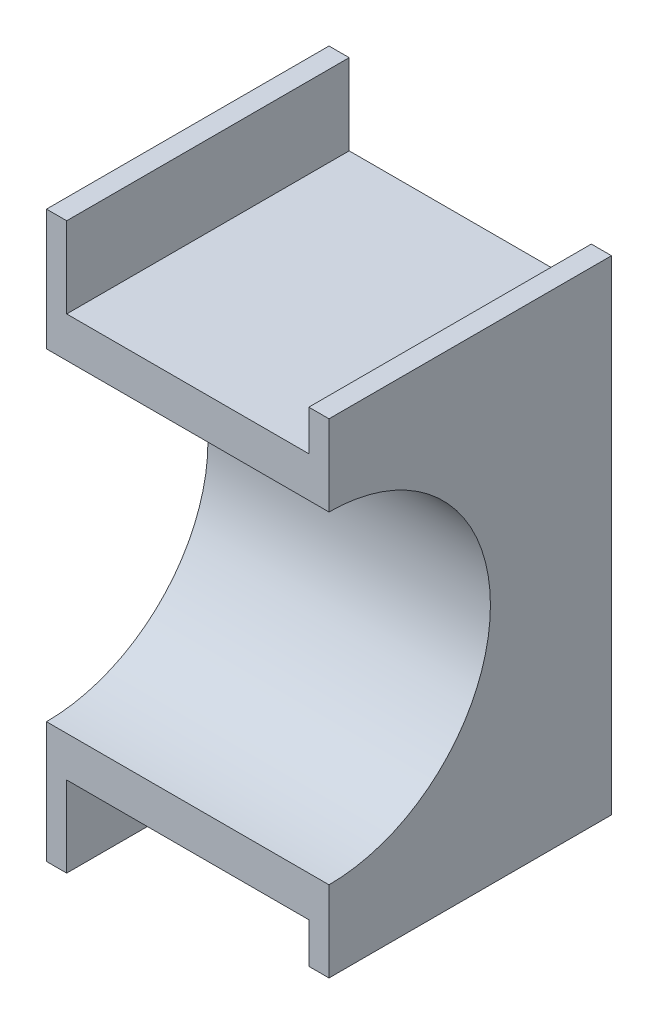
ISO-10303-21;
HEADER;
FILE_DESCRIPTION(('STEP AP214'),'2;1');
FILE_NAME('part.step','',(''),(''),'','','');
FILE_SCHEMA(('AUTOMOTIVE_DESIGN { 1 0 10303 214 1 1 1 1 }'));
ENDSEC;
DATA;
#1=APPLICATION_CONTEXT('core data for automotive mechanical design processes');
#2=APPLICATION_PROTOCOL_DEFINITION('international standard','automotive_design',2000,#1);
#3=PRODUCT_CONTEXT('',#1,'mechanical');
#4=PRODUCT('Part','Part','',(#3));
#5=PRODUCT_RELATED_PRODUCT_CATEGORY('part','',(#4));
#6=PRODUCT_DEFINITION_FORMATION('','',#4);
#7=PRODUCT_DEFINITION_CONTEXT('part definition',#1,'design');
#8=PRODUCT_DEFINITION('design','',#6,#7);
#9=PRODUCT_DEFINITION_SHAPE('','',#8);
#10=(LENGTH_UNIT() NAMED_UNIT(*) SI_UNIT(.MILLI.,.METRE.));
#11=(NAMED_UNIT(*) PLANE_ANGLE_UNIT() SI_UNIT($,.RADIAN.));
#12=(NAMED_UNIT(*) SI_UNIT($,.STERADIAN.) SOLID_ANGLE_UNIT());
#13=UNCERTAINTY_MEASURE_WITH_UNIT(LENGTH_MEASURE(1.E-05),#10,'distance_accuracy_value','');
#14=(GEOMETRIC_REPRESENTATION_CONTEXT(3) GLOBAL_UNCERTAINTY_ASSIGNED_CONTEXT((#13)) GLOBAL_UNIT_ASSIGNED_CONTEXT((#10,
#11,#12)) REPRESENTATION_CONTEXT('',''));
#15=CARTESIAN_POINT('',(0.,0.,0.));
#16=DIRECTION('',(0.,0.,1.));
#17=DIRECTION('',(1.,0.,0.));
#18=AXIS2_PLACEMENT_3D('',#15,#16,#17);
#19=CARTESIAN_POINT('',(0.,0.,3.5));
#20=DIRECTION('',(0.,0.,1.));
#21=DIRECTION('',(1.,0.,0.));
#22=AXIS2_PLACEMENT_3D('',#19,#20,#21);
#23=PLANE('',#22);
#24=DIRECTION('',(1.,0.,0.));
#25=VECTOR('',#24,1.);
#26=CARTESIAN_POINT('',(0.,-3.,3.5));
#27=LINE('',#26,#25);
#28=CARTESIAN_POINT('',(1.75,-3.,3.5));
#29=VERTEX_POINT('',#28);
#30=CARTESIAN_POINT('',(2.,-3.,3.5));
#31=VERTEX_POINT('',#30);
#32=EDGE_CURVE('E55',#29,#31,#27,.T.);
#33=ORIENTED_EDGE('',*,*,#32,.T.);
#34=DIRECTION('',(0.,1.,0.));
#35=VECTOR('',#34,1.);
#36=CARTESIAN_POINT('',(2.,3.5,3.5));
#37=LINE('',#36,#35);
#38=CARTESIAN_POINT('',(2.,-2.,3.5));
#39=VERTEX_POINT('',#38);
#40=EDGE_CURVE('E147',#31,#39,#37,.T.);
#41=ORIENTED_EDGE('',*,*,#40,.T.);
#42=DIRECTION('',(1.,0.,0.));
#43=VECTOR('',#42,1.);
#44=CARTESIAN_POINT('',(-8.,-2.,3.5));
#45=LINE('',#44,#43);
#46=CARTESIAN_POINT('',(-1.5,-2.,3.5));
#47=VERTEX_POINT('',#46);
#48=EDGE_CURVE('E170',#47,#39,#45,.T.);
#49=ORIENTED_EDGE('',*,*,#48,.F.);
#50=DIRECTION('',(0.,-1.,0.));
#51=VECTOR('',#50,1.);
#52=CARTESIAN_POINT('',(-1.5,3.5,3.5));
#53=LINE('',#52,#51);
#54=CARTESIAN_POINT('',(-1.5,-3.5,3.5));
#55=VERTEX_POINT('',#54);
#56=EDGE_CURVE('E154',#47,#55,#53,.T.);
#57=ORIENTED_EDGE('',*,*,#56,.T.);
#58=DIRECTION('',(1.,0.,0.));
#59=VECTOR('',#58,1.);
#60=CARTESIAN_POINT('',(-1.5,-3.5,3.5));
#61=LINE('',#60,#59);
#62=CARTESIAN_POINT('',(-1.25,-3.5,3.5));
#63=VERTEX_POINT('',#62);
#64=EDGE_CURVE('E222',#55,#63,#61,.T.);
#65=ORIENTED_EDGE('',*,*,#64,.T.);
#66=DIRECTION('',(0.,-1.,0.));
#67=VECTOR('',#66,1.);
#68=CARTESIAN_POINT('',(-1.25,-2.5,3.5));
#69=LINE('',#68,#67);
#70=CARTESIAN_POINT('',(-1.25,-2.5,3.5));
#71=VERTEX_POINT('',#70);
#72=EDGE_CURVE('E196',#71,#63,#69,.T.);
#73=ORIENTED_EDGE('',*,*,#72,.F.);
#74=DIRECTION('',(-1.,0.,0.));
#75=VECTOR('',#74,1.);
#76=CARTESIAN_POINT('',(1.75,-2.5,3.5));
#77=LINE('',#76,#75);
#78=CARTESIAN_POINT('',(1.75,-2.5,3.5));
#79=VERTEX_POINT('',#78);
#80=EDGE_CURVE('E183',#79,#71,#77,.T.);
#81=ORIENTED_EDGE('',*,*,#80,.F.);
#82=DIRECTION('',(0.,-1.,0.));
#83=VECTOR('',#82,1.);
#84=CARTESIAN_POINT('',(1.75,-2.5,3.5));
#85=LINE('',#84,#83);
#86=EDGE_CURVE('E176',#79,#29,#85,.T.);
#87=ORIENTED_EDGE('',*,*,#86,.T.);
#88=EDGE_LOOP('',(#33,#41,#49,#57,#65,#73,#81,#87));
#89=FACE_BOUND('',#88,.T.);
#90=ADVANCED_FACE('F33',(#89),#23,.T.);
#91=CARTESIAN_POINT('',(-1.5,-3.5,3.5));
#92=DIRECTION('',(0.,1.,0.));
#93=DIRECTION('',(0.,0.,1.));
#94=AXIS2_PLACEMENT_3D('',#91,#92,#93);
#95=PLANE('',#94);
#96=DIRECTION('',(0.,0.,1.));
#97=VECTOR('',#96,1.);
#98=CARTESIAN_POINT('',(-1.25,-3.5,0.));
#99=LINE('',#98,#97);
#100=CARTESIAN_POINT('',(-1.25,-3.5,0.));
#101=VERTEX_POINT('',#100);
#102=EDGE_CURVE('E191',#101,#63,#99,.T.);
#103=ORIENTED_EDGE('',*,*,#102,.T.);
#104=ORIENTED_EDGE('',*,*,#64,.F.);
#105=DIRECTION('',(0.,0.,-1.));
#106=VECTOR('',#105,1.);
#107=CARTESIAN_POINT('',(-1.5,-3.5,3.5));
#108=LINE('',#107,#106);
#109=CARTESIAN_POINT('',(-1.5,-3.5,0.));
#110=VERTEX_POINT('',#109);
#111=EDGE_CURVE('E164',#55,#110,#108,.T.);
#112=ORIENTED_EDGE('',*,*,#111,.T.);
#113=DIRECTION('',(1.,0.,0.));
#114=VECTOR('',#113,1.);
#115=CARTESIAN_POINT('',(-1.5,-3.5,0.));
#116=LINE('',#115,#114);
#117=EDGE_CURVE('E152',#110,#101,#116,.T.);
#118=ORIENTED_EDGE('',*,*,#117,.T.);
#119=EDGE_LOOP('',(#103,#104,#112,#118));
#120=FACE_BOUND('',#119,.T.);
#121=ADVANCED_FACE('F241',(#120),#95,.F.);
#122=CARTESIAN_POINT('',(-1.5,3.5,3.5));
#123=DIRECTION('',(1.,0.,0.));
#124=DIRECTION('',(0.,1.,0.));
#125=AXIS2_PLACEMENT_3D('',#122,#123,#124);
#126=PLANE('',#125);
#127=ORIENTED_EDGE('',*,*,#56,.F.);
#128=CARTESIAN_POINT('',(-1.5,0.,3.5));
#129=DIRECTION('',(1.,0.,0.));
#130=DIRECTION('',(0.,1.,0.));
#131=AXIS2_PLACEMENT_3D('',#128,#129,#130);
#132=CIRCLE('',#131,2.);
#133=CARTESIAN_POINT('',(-1.5,2.,3.5));
#134=VERTEX_POINT('',#133);
#135=EDGE_CURVE('E244',#47,#134,#132,.T.);
#136=ORIENTED_EDGE('',*,*,#135,.T.);
#137=CARTESIAN_POINT('',(-1.5,3.5,3.5));
#138=VERTEX_POINT('',#137);
#139=EDGE_CURVE('E219',#138,#134,#53,.T.);
#140=ORIENTED_EDGE('',*,*,#139,.F.);
#141=DIRECTION('',(0.,0.,-1.));
#142=VECTOR('',#141,1.);
#143=CARTESIAN_POINT('',(-1.5,3.5,3.5));
#144=LINE('',#143,#142);
#145=CARTESIAN_POINT('',(-1.5,3.5,0.));
#146=VERTEX_POINT('',#145);
#147=EDGE_CURVE('E161',#138,#146,#144,.T.);
#148=ORIENTED_EDGE('',*,*,#147,.T.);
#149=DIRECTION('',(0.,-1.,0.));
#150=VECTOR('',#149,1.);
#151=CARTESIAN_POINT('',(-1.5,3.5,0.));
#152=LINE('',#151,#150);
#153=EDGE_CURVE('E157',#146,#110,#152,.T.);
#154=ORIENTED_EDGE('',*,*,#153,.T.);
#155=ORIENTED_EDGE('',*,*,#111,.F.);
#156=EDGE_LOOP('',(#127,#136,#140,#148,#154,#155));
#157=FACE_BOUND('',#156,.T.);
#158=ADVANCED_FACE('F35',(#157),#126,.F.);
#159=CARTESIAN_POINT('',(2.,3.5,3.5));
#160=DIRECTION('',(-1.,0.,0.));
#161=DIRECTION('',(0.,-1.,0.));
#162=AXIS2_PLACEMENT_3D('',#159,#160,#161);
#163=PLANE('',#162);
#164=ORIENTED_EDGE('',*,*,#40,.F.);
#165=DIRECTION('',(0.,0.,1.));
#166=VECTOR('',#165,1.);
#167=CARTESIAN_POINT('',(2.,-3.,3.5));
#168=LINE('',#167,#166);
#169=CARTESIAN_POINT('',(2.,-3.,0.));
#170=VERTEX_POINT('',#169);
#171=EDGE_CURVE('E134',#170,#31,#168,.T.);
#172=ORIENTED_EDGE('',*,*,#171,.F.);
#173=DIRECTION('',(0.,1.,0.));
#174=VECTOR('',#173,1.);
#175=CARTESIAN_POINT('',(2.,3.5,0.));
#176=LINE('',#175,#174);
#177=CARTESIAN_POINT('',(2.,3.,0.));
#178=VERTEX_POINT('',#177);
#179=EDGE_CURVE('E145',#170,#178,#176,.T.);
#180=ORIENTED_EDGE('',*,*,#179,.T.);
#181=DIRECTION('',(0.,0.,-1.));
#182=VECTOR('',#181,1.);
#183=CARTESIAN_POINT('',(2.,3.,0.));
#184=LINE('',#183,#182);
#185=CARTESIAN_POINT('',(2.,3.,3.5));
#186=VERTEX_POINT('',#185);
#187=EDGE_CURVE('E270',#186,#178,#184,.T.);
#188=ORIENTED_EDGE('',*,*,#187,.F.);
#189=CARTESIAN_POINT('',(2.,2.,3.5));
#190=VERTEX_POINT('',#189);
#191=EDGE_CURVE('E225',#190,#186,#37,.T.);
#192=ORIENTED_EDGE('',*,*,#191,.F.);
#193=CARTESIAN_POINT('',(2.,0.,3.5));
#194=DIRECTION('',(1.,0.,0.));
#195=DIRECTION('',(0.,1.,0.));
#196=AXIS2_PLACEMENT_3D('',#193,#194,#195);
#197=CIRCLE('',#196,2.);
#198=EDGE_CURVE('E246',#39,#190,#197,.T.);
#199=ORIENTED_EDGE('',*,*,#198,.F.);
#200=EDGE_LOOP('',(#164,#172,#180,#188,#192,#199));
#201=FACE_BOUND('',#200,.T.);
#202=ADVANCED_FACE('F143',(#201),#163,.F.);
#203=CARTESIAN_POINT('',(-1.5,3.5,3.5));
#204=DIRECTION('',(0.,-1.,0.));
#205=DIRECTION('',(0.,0.,-1.));
#206=AXIS2_PLACEMENT_3D('',#203,#204,#205);
#207=PLANE('',#206);
#208=DIRECTION('',(-1.,0.,0.));
#209=VECTOR('',#208,1.);
#210=CARTESIAN_POINT('',(-1.5,3.5,3.5));
#211=LINE('',#210,#209);
#212=CARTESIAN_POINT('',(-1.25,3.5,3.5));
#213=VERTEX_POINT('',#212);
#214=EDGE_CURVE('E165',#213,#138,#211,.T.);
#215=ORIENTED_EDGE('',*,*,#214,.F.);
#216=DIRECTION('',(0.,0.,1.));
#217=VECTOR('',#216,1.);
#218=CARTESIAN_POINT('',(-1.25,3.5,0.));
#219=LINE('',#218,#217);
#220=CARTESIAN_POINT('',(-1.25,3.5,0.));
#221=VERTEX_POINT('',#220);
#222=EDGE_CURVE('E184',#221,#213,#219,.T.);
#223=ORIENTED_EDGE('',*,*,#222,.F.);
#224=DIRECTION('',(-1.,0.,0.));
#225=VECTOR('',#224,1.);
#226=CARTESIAN_POINT('',(-1.5,3.5,0.));
#227=LINE('',#226,#225);
#228=EDGE_CURVE('E151',#221,#146,#227,.T.);
#229=ORIENTED_EDGE('',*,*,#228,.T.);
#230=ORIENTED_EDGE('',*,*,#147,.F.);
#231=EDGE_LOOP('',(#215,#223,#229,#230));
#232=FACE_BOUND('',#231,.T.);
#233=ADVANCED_FACE('F258',(#232),#207,.F.);
#234=DIRECTION('',(1.,0.,0.));
#235=VECTOR('',#234,1.);
#236=CARTESIAN_POINT('',(0.,3.,3.5));
#237=LINE('',#236,#235);
#238=CARTESIAN_POINT('',(1.75,3.,3.5));
#239=VERTEX_POINT('',#238);
#240=EDGE_CURVE('E269',#239,#186,#237,.T.);
#241=ORIENTED_EDGE('',*,*,#240,.F.);
#242=DIRECTION('',(0.,1.,0.));
#243=VECTOR('',#242,1.);
#244=CARTESIAN_POINT('',(1.75,2.5,3.5));
#245=LINE('',#244,#243);
#246=CARTESIAN_POINT('',(1.75,2.5,3.5));
#247=VERTEX_POINT('',#246);
#248=EDGE_CURVE('E208',#247,#239,#245,.T.);
#249=ORIENTED_EDGE('',*,*,#248,.F.);
#250=DIRECTION('',(1.,0.,0.));
#251=VECTOR('',#250,1.);
#252=CARTESIAN_POINT('',(-1.25,2.5,3.5));
#253=LINE('',#252,#251);
#254=CARTESIAN_POINT('',(-1.25,2.5,3.5));
#255=VERTEX_POINT('',#254);
#256=EDGE_CURVE('E186',#255,#247,#253,.T.);
#257=ORIENTED_EDGE('',*,*,#256,.F.);
#258=DIRECTION('',(0.,1.,0.));
#259=VECTOR('',#258,1.);
#260=CARTESIAN_POINT('',(-1.25,2.5,3.5));
#261=LINE('',#260,#259);
#262=EDGE_CURVE('E210',#255,#213,#261,.T.);
#263=ORIENTED_EDGE('',*,*,#262,.T.);
#264=ORIENTED_EDGE('',*,*,#214,.T.);
#265=ORIENTED_EDGE('',*,*,#139,.T.);
#266=DIRECTION('',(1.,0.,0.));
#267=VECTOR('',#266,1.);
#268=CARTESIAN_POINT('',(-8.,2.,3.5));
#269=LINE('',#268,#267);
#270=EDGE_CURVE('E168',#190,#134,#269,.F.);
#271=ORIENTED_EDGE('',*,*,#270,.F.);
#272=ORIENTED_EDGE('',*,*,#191,.T.);
#273=EDGE_LOOP('',(#241,#249,#257,#263,#264,#265,#271,#272));
#274=FACE_BOUND('',#273,.T.);
#275=ADVANCED_FACE('F251',(#274),#23,.T.);
#276=CARTESIAN_POINT('',(0.,0.,0.));
#277=DIRECTION('',(0.,0.,1.));
#278=DIRECTION('',(1.,0.,0.));
#279=AXIS2_PLACEMENT_3D('',#276,#277,#278);
#280=PLANE('',#279);
#281=ORIENTED_EDGE('',*,*,#179,.F.);
#282=DIRECTION('',(1.,0.,0.));
#283=VECTOR('',#282,1.);
#284=CARTESIAN_POINT('',(0.,-3.,0.));
#285=LINE('',#284,#283);
#286=CARTESIAN_POINT('',(1.75,-3.,0.));
#287=VERTEX_POINT('',#286);
#288=EDGE_CURVE('E131',#287,#170,#285,.T.);
#289=ORIENTED_EDGE('',*,*,#288,.F.);
#290=DIRECTION('',(0.,-1.,0.));
#291=VECTOR('',#290,1.);
#292=CARTESIAN_POINT('',(1.75,-2.5,0.));
#293=LINE('',#292,#291);
#294=CARTESIAN_POINT('',(1.75,-2.5,0.));
#295=VERTEX_POINT('',#294);
#296=EDGE_CURVE('E178',#295,#287,#293,.T.);
#297=ORIENTED_EDGE('',*,*,#296,.F.);
#298=DIRECTION('',(-1.,0.,0.));
#299=VECTOR('',#298,1.);
#300=CARTESIAN_POINT('',(1.75,-2.5,0.));
#301=LINE('',#300,#299);
#302=CARTESIAN_POINT('',(-1.25,-2.5,0.));
#303=VERTEX_POINT('',#302);
#304=EDGE_CURVE('E279',#295,#303,#301,.T.);
#305=ORIENTED_EDGE('',*,*,#304,.T.);
#306=DIRECTION('',(0.,-1.,0.));
#307=VECTOR('',#306,1.);
#308=CARTESIAN_POINT('',(-1.25,-2.5,0.));
#309=LINE('',#308,#307);
#310=EDGE_CURVE('E188',#303,#101,#309,.T.);
#311=ORIENTED_EDGE('',*,*,#310,.T.);
#312=ORIENTED_EDGE('',*,*,#117,.F.);
#313=ORIENTED_EDGE('',*,*,#153,.F.);
#314=ORIENTED_EDGE('',*,*,#228,.F.);
#315=DIRECTION('',(0.,1.,0.));
#316=VECTOR('',#315,1.);
#317=CARTESIAN_POINT('',(-1.25,2.5,0.));
#318=LINE('',#317,#316);
#319=CARTESIAN_POINT('',(-1.25,2.5,0.));
#320=VERTEX_POINT('',#319);
#321=EDGE_CURVE('E213',#320,#221,#318,.T.);
#322=ORIENTED_EDGE('',*,*,#321,.F.);
#323=DIRECTION('',(1.,0.,0.));
#324=VECTOR('',#323,1.);
#325=CARTESIAN_POINT('',(-1.25,2.5,0.));
#326=LINE('',#325,#324);
#327=CARTESIAN_POINT('',(1.75,2.5,0.));
#328=VERTEX_POINT('',#327);
#329=EDGE_CURVE('E203',#320,#328,#326,.T.);
#330=ORIENTED_EDGE('',*,*,#329,.T.);
#331=DIRECTION('',(0.,1.,0.));
#332=VECTOR('',#331,1.);
#333=CARTESIAN_POINT('',(1.75,2.5,0.));
#334=LINE('',#333,#332);
#335=CARTESIAN_POINT('',(1.75,3.,0.));
#336=VERTEX_POINT('',#335);
#337=EDGE_CURVE('E215',#328,#336,#334,.T.);
#338=ORIENTED_EDGE('',*,*,#337,.T.);
#339=DIRECTION('',(1.,0.,0.));
#340=VECTOR('',#339,1.);
#341=CARTESIAN_POINT('',(0.,3.,0.));
#342=LINE('',#341,#340);
#343=EDGE_CURVE('E47',#336,#178,#342,.T.);
#344=ORIENTED_EDGE('',*,*,#343,.T.);
#345=EDGE_LOOP('',(#281,#289,#297,#305,#311,#312,#313,#314,#322,#330,#338,#344));
#346=FACE_BOUND('',#345,.T.);
#347=ADVANCED_FACE('F149',(#346),#280,.F.);
#348=CARTESIAN_POINT('',(-1.25,2.5,0.));
#349=DIRECTION('',(-1.,0.,0.));
#350=DIRECTION('',(0.,0.,1.));
#351=AXIS2_PLACEMENT_3D('',#348,#349,#350);
#352=PLANE('',#351);
#353=ORIENTED_EDGE('',*,*,#222,.T.);
#354=ORIENTED_EDGE('',*,*,#262,.F.);
#355=DIRECTION('',(0.,0.,1.));
#356=VECTOR('',#355,1.);
#357=CARTESIAN_POINT('',(-1.25,2.5,0.));
#358=LINE('',#357,#356);
#359=EDGE_CURVE('E206',#320,#255,#358,.T.);
#360=ORIENTED_EDGE('',*,*,#359,.F.);
#361=ORIENTED_EDGE('',*,*,#321,.T.);
#362=EDGE_LOOP('',(#353,#354,#360,#361));
#363=FACE_BOUND('',#362,.T.);
#364=ADVANCED_FACE('F260',(#363),#352,.F.);
#365=CARTESIAN_POINT('',(1.75,2.5,0.));
#366=DIRECTION('',(-1.,0.,0.));
#367=DIRECTION('',(0.,0.,1.));
#368=AXIS2_PLACEMENT_3D('',#365,#366,#367);
#369=PLANE('',#368);
#370=DIRECTION('',(0.,0.,1.));
#371=VECTOR('',#370,1.);
#372=CARTESIAN_POINT('',(1.75,3.,0.));
#373=LINE('',#372,#371);
#374=EDGE_CURVE('E11',#336,#239,#373,.T.);
#375=ORIENTED_EDGE('',*,*,#374,.F.);
#376=ORIENTED_EDGE('',*,*,#337,.F.);
#377=DIRECTION('',(0.,0.,1.));
#378=VECTOR('',#377,1.);
#379=CARTESIAN_POINT('',(1.75,2.5,0.));
#380=LINE('',#379,#378);
#381=EDGE_CURVE('E201',#328,#247,#380,.T.);
#382=ORIENTED_EDGE('',*,*,#381,.T.);
#383=ORIENTED_EDGE('',*,*,#248,.T.);
#384=EDGE_LOOP('',(#375,#376,#382,#383));
#385=FACE_BOUND('',#384,.T.);
#386=ADVANCED_FACE('F267',(#385),#369,.T.);
#387=CARTESIAN_POINT('',(0.,2.5,0.));
#388=DIRECTION('',(0.,-1.,0.));
#389=DIRECTION('',(0.,0.,-1.));
#390=AXIS2_PLACEMENT_3D('',#387,#388,#389);
#391=PLANE('',#390);
#392=ORIENTED_EDGE('',*,*,#256,.T.);
#393=ORIENTED_EDGE('',*,*,#381,.F.);
#394=ORIENTED_EDGE('',*,*,#329,.F.);
#395=ORIENTED_EDGE('',*,*,#359,.T.);
#396=EDGE_LOOP('',(#392,#393,#394,#395));
#397=FACE_BOUND('',#396,.T.);
#398=ADVANCED_FACE('F264',(#397),#391,.F.);
#399=CARTESIAN_POINT('',(1.75,-2.5,0.));
#400=DIRECTION('',(1.,0.,0.));
#401=DIRECTION('',(0.,0.,-1.));
#402=AXIS2_PLACEMENT_3D('',#399,#400,#401);
#403=PLANE('',#402);
#404=ORIENTED_EDGE('',*,*,#296,.T.);
#405=DIRECTION('',(0.,0.,1.));
#406=VECTOR('',#405,1.);
#407=CARTESIAN_POINT('',(1.75,-3.,0.));
#408=LINE('',#407,#406);
#409=EDGE_CURVE('E41',#287,#29,#408,.T.);
#410=ORIENTED_EDGE('',*,*,#409,.T.);
#411=ORIENTED_EDGE('',*,*,#86,.F.);
#412=DIRECTION('',(0.,0.,1.));
#413=VECTOR('',#412,1.);
#414=CARTESIAN_POINT('',(1.75,-2.5,0.));
#415=LINE('',#414,#413);
#416=EDGE_CURVE('E198',#295,#79,#415,.T.);
#417=ORIENTED_EDGE('',*,*,#416,.F.);
#418=EDGE_LOOP('',(#404,#410,#411,#417));
#419=FACE_BOUND('',#418,.T.);
#420=ADVANCED_FACE('F174',(#419),#403,.F.);
#421=CARTESIAN_POINT('',(-1.25,-2.5,0.));
#422=DIRECTION('',(1.,0.,0.));
#423=DIRECTION('',(0.,0.,-1.));
#424=AXIS2_PLACEMENT_3D('',#421,#422,#423);
#425=PLANE('',#424);
#426=ORIENTED_EDGE('',*,*,#102,.F.);
#427=ORIENTED_EDGE('',*,*,#310,.F.);
#428=DIRECTION('',(0.,0.,1.));
#429=VECTOR('',#428,1.);
#430=CARTESIAN_POINT('',(-1.25,-2.5,0.));
#431=LINE('',#430,#429);
#432=EDGE_CURVE('E277',#303,#71,#431,.T.);
#433=ORIENTED_EDGE('',*,*,#432,.T.);
#434=ORIENTED_EDGE('',*,*,#72,.T.);
#435=EDGE_LOOP('',(#426,#427,#433,#434));
#436=FACE_BOUND('',#435,.T.);
#437=ADVANCED_FACE('F283',(#436),#425,.T.);
#438=CARTESIAN_POINT('',(0.,-2.5,0.));
#439=DIRECTION('',(0.,1.,0.));
#440=DIRECTION('',(0.,0.,1.));
#441=AXIS2_PLACEMENT_3D('',#438,#439,#440);
#442=PLANE('',#441);
#443=ORIENTED_EDGE('',*,*,#80,.T.);
#444=ORIENTED_EDGE('',*,*,#432,.F.);
#445=ORIENTED_EDGE('',*,*,#304,.F.);
#446=ORIENTED_EDGE('',*,*,#416,.T.);
#447=EDGE_LOOP('',(#443,#444,#445,#446));
#448=FACE_BOUND('',#447,.T.);
#449=ADVANCED_FACE('F281',(#448),#442,.F.);
#450=CARTESIAN_POINT('',(-8.,0.,3.5));
#451=DIRECTION('',(1.,0.,0.));
#452=DIRECTION('',(0.,1.,0.));
#453=AXIS2_PLACEMENT_3D('',#450,#451,#452);
#454=CYLINDRICAL_SURFACE('',#453,2.);
#455=ORIENTED_EDGE('',*,*,#48,.T.);
#456=ORIENTED_EDGE('',*,*,#198,.T.);
#457=ORIENTED_EDGE('',*,*,#270,.T.);
#458=ORIENTED_EDGE('',*,*,#135,.F.);
#459=EDGE_LOOP('',(#455,#456,#457,#458));
#460=FACE_BOUND('',#459,.T.);
#461=ADVANCED_FACE('F290',(#460),#454,.F.);
#462=CARTESIAN_POINT('',(0.,-3.,3.5));
#463=DIRECTION('',(0.,1.,0.));
#464=DIRECTION('',(-1.,0.,0.));
#465=AXIS2_PLACEMENT_3D('',#462,#463,#464);
#466=PLANE('',#465);
#467=ORIENTED_EDGE('',*,*,#288,.T.);
#468=ORIENTED_EDGE('',*,*,#171,.T.);
#469=ORIENTED_EDGE('',*,*,#32,.F.);
#470=ORIENTED_EDGE('',*,*,#409,.F.);
#471=EDGE_LOOP('',(#467,#468,#469,#470));
#472=FACE_BOUND('',#471,.T.);
#473=ADVANCED_FACE('F133',(#472),#466,.F.);
#474=CARTESIAN_POINT('',(0.,3.,0.));
#475=DIRECTION('',(0.,-1.,0.));
#476=DIRECTION('',(0.,0.,-1.));
#477=AXIS2_PLACEMENT_3D('',#474,#475,#476);
#478=PLANE('',#477);
#479=ORIENTED_EDGE('',*,*,#374,.T.);
#480=ORIENTED_EDGE('',*,*,#240,.T.);
#481=ORIENTED_EDGE('',*,*,#187,.T.);
#482=ORIENTED_EDGE('',*,*,#343,.F.);
#483=EDGE_LOOP('',(#479,#480,#481,#482));
#484=FACE_BOUND('',#483,.T.);
#485=ADVANCED_FACE('F268',(#484),#478,.F.);
#486=CLOSED_SHELL('',(#90,#121,#158,#202,#233,#275,#347,#364,#386,#398,#420,#437,#449,#461,#473,#485));
#487=MANIFOLD_SOLID_BREP('B2',#486);
#488=ADVANCED_BREP_SHAPE_REPRESENTATION('',(#18,#487),#14);
#489=SHAPE_DEFINITION_REPRESENTATION(#9,#488);
ENDSEC;
END-ISO-10303-21;
